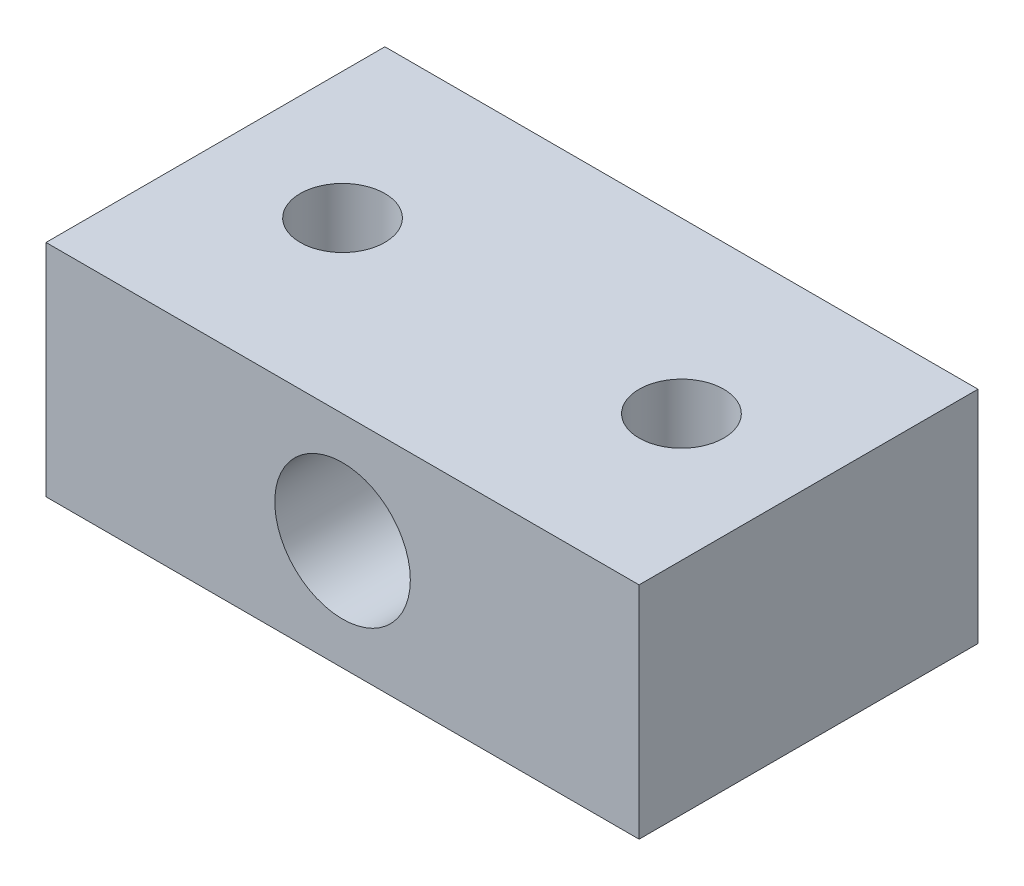
ISO-10303-21;
HEADER;
FILE_DESCRIPTION(('STEP AP214'),'2;1');
FILE_NAME('part.step','',(''),(''),'','','');
FILE_SCHEMA(('AUTOMOTIVE_DESIGN { 1 0 10303 214 1 1 1 1 }'));
ENDSEC;
DATA;
#1=APPLICATION_CONTEXT('core data for automotive mechanical design processes');
#2=APPLICATION_PROTOCOL_DEFINITION('international standard','automotive_design',2000,#1);
#3=PRODUCT_CONTEXT('',#1,'mechanical');
#4=PRODUCT('Part','Part','',(#3));
#5=PRODUCT_RELATED_PRODUCT_CATEGORY('part','',(#4));
#6=PRODUCT_DEFINITION_FORMATION('','',#4);
#7=PRODUCT_DEFINITION_CONTEXT('part definition',#1,'design');
#8=PRODUCT_DEFINITION('design','',#6,#7);
#9=PRODUCT_DEFINITION_SHAPE('','',#8);
#10=(LENGTH_UNIT() NAMED_UNIT(*) SI_UNIT(.MILLI.,.METRE.));
#11=(NAMED_UNIT(*) PLANE_ANGLE_UNIT() SI_UNIT($,.RADIAN.));
#12=(NAMED_UNIT(*) SI_UNIT($,.STERADIAN.) SOLID_ANGLE_UNIT());
#13=UNCERTAINTY_MEASURE_WITH_UNIT(LENGTH_MEASURE(1.E-05),#10,'distance_accuracy_value','');
#14=(GEOMETRIC_REPRESENTATION_CONTEXT(3) GLOBAL_UNCERTAINTY_ASSIGNED_CONTEXT((#13)) GLOBAL_UNIT_ASSIGNED_CONTEXT((#10,
#11,#12)) REPRESENTATION_CONTEXT('',''));
#15=CARTESIAN_POINT('',(0.,0.,0.));
#16=DIRECTION('',(0.,0.,1.));
#17=DIRECTION('',(1.,0.,0.));
#18=AXIS2_PLACEMENT_3D('',#15,#16,#17);
#19=CARTESIAN_POINT('',(0.,13.,0.));
#20=DIRECTION('',(0.,1.,0.));
#21=DIRECTION('',(0.,0.,1.));
#22=AXIS2_PLACEMENT_3D('',#19,#20,#21);
#23=PLANE('',#22);
#24=CARTESIAN_POINT('',(-10.,13.,0.));
#25=DIRECTION('',(0.,1.,0.));
#26=DIRECTION('',(0.,0.,1.));
#27=AXIS2_PLACEMENT_3D('',#24,#25,#26);
#28=CIRCLE('',#27,2.5);
#29=CARTESIAN_POINT('',(-10.,13.,2.5));
#30=VERTEX_POINT('',#29);
#31=EDGE_CURVE('E100',#30,#30,#28,.T.);
#32=ORIENTED_EDGE('',*,*,#31,.F.);
#33=EDGE_LOOP('',(#32));
#34=FACE_BOUND('',#33,.T.);
#35=DIRECTION('',(0.,0.,-1.));
#36=VECTOR('',#35,1.);
#37=CARTESIAN_POINT('',(17.5,13.,-10.));
#38=LINE('',#37,#36);
#39=CARTESIAN_POINT('',(17.5,13.,9.99999999999999));
#40=VERTEX_POINT('',#39);
#41=CARTESIAN_POINT('',(17.5,13.,-10.));
#42=VERTEX_POINT('',#41);
#43=EDGE_CURVE('E85',#40,#42,#38,.T.);
#44=ORIENTED_EDGE('',*,*,#43,.T.);
#45=DIRECTION('',(-1.,0.,0.));
#46=VECTOR('',#45,1.);
#47=CARTESIAN_POINT('',(-17.5,13.,-10.));
#48=LINE('',#47,#46);
#49=CARTESIAN_POINT('',(-17.5,13.,-10.));
#50=VERTEX_POINT('',#49);
#51=EDGE_CURVE('E80',#42,#50,#48,.T.);
#52=ORIENTED_EDGE('',*,*,#51,.T.);
#53=DIRECTION('',(0.,0.,1.));
#54=VECTOR('',#53,1.);
#55=CARTESIAN_POINT('',(-17.5,13.,-10.));
#56=LINE('',#55,#54);
#57=CARTESIAN_POINT('',(-17.5,13.,9.99999999999999));
#58=VERTEX_POINT('',#57);
#59=EDGE_CURVE('E83',#50,#58,#56,.T.);
#60=ORIENTED_EDGE('',*,*,#59,.T.);
#61=DIRECTION('',(1.,0.,0.));
#62=VECTOR('',#61,1.);
#63=CARTESIAN_POINT('',(-17.5,13.,9.99999999999999));
#64=LINE('',#63,#62);
#65=EDGE_CURVE('E50',#58,#40,#64,.T.);
#66=ORIENTED_EDGE('',*,*,#65,.T.);
#67=EDGE_LOOP('',(#44,#52,#60,#66));
#68=FACE_BOUND('',#67,.T.);
#69=CARTESIAN_POINT('',(9.99999999999996,13.,0.));
#70=DIRECTION('',(0.,1.,0.));
#71=DIRECTION('',(0.,0.,1.));
#72=AXIS2_PLACEMENT_3D('',#69,#70,#71);
#73=CIRCLE('',#72,2.5);
#74=CARTESIAN_POINT('',(9.99999999999996,13.,2.5));
#75=VERTEX_POINT('',#74);
#76=EDGE_CURVE('E115',#75,#75,#73,.T.);
#77=ORIENTED_EDGE('',*,*,#76,.F.);
#78=EDGE_LOOP('',(#77));
#79=FACE_BOUND('',#78,.T.);
#80=ADVANCED_FACE('F33',(#34,#68,#79),#23,.T.);
#81=CARTESIAN_POINT('',(0.,0.,0.));
#82=DIRECTION('',(0.,1.,0.));
#83=DIRECTION('',(0.,0.,1.));
#84=AXIS2_PLACEMENT_3D('',#81,#82,#83);
#85=PLANE('',#84);
#86=CARTESIAN_POINT('',(-10.,0.,0.));
#87=DIRECTION('',(0.,1.,0.));
#88=DIRECTION('',(0.,0.,1.));
#89=AXIS2_PLACEMENT_3D('',#86,#87,#88);
#90=CIRCLE('',#89,2.5);
#91=CARTESIAN_POINT('',(-10.,0.,2.5));
#92=VERTEX_POINT('',#91);
#93=EDGE_CURVE('E112',#92,#92,#90,.T.);
#94=ORIENTED_EDGE('',*,*,#93,.T.);
#95=EDGE_LOOP('',(#94));
#96=FACE_BOUND('',#95,.T.);
#97=DIRECTION('',(0.,0.,-1.));
#98=VECTOR('',#97,1.);
#99=CARTESIAN_POINT('',(17.5,0.,-10.));
#100=LINE('',#99,#98);
#101=CARTESIAN_POINT('',(17.5,0.,9.99999999999999));
#102=VERTEX_POINT('',#101);
#103=CARTESIAN_POINT('',(17.5,0.,-10.));
#104=VERTEX_POINT('',#103);
#105=EDGE_CURVE('E97',#102,#104,#100,.T.);
#106=ORIENTED_EDGE('',*,*,#105,.F.);
#107=DIRECTION('',(1.,0.,0.));
#108=VECTOR('',#107,1.);
#109=CARTESIAN_POINT('',(-17.5,0.,9.99999999999999));
#110=LINE('',#109,#108);
#111=CARTESIAN_POINT('',(-17.5,0.,9.99999999999999));
#112=VERTEX_POINT('',#111);
#113=EDGE_CURVE('E73',#112,#102,#110,.T.);
#114=ORIENTED_EDGE('',*,*,#113,.F.);
#115=DIRECTION('',(0.,0.,1.));
#116=VECTOR('',#115,1.);
#117=CARTESIAN_POINT('',(-17.5,0.,-10.));
#118=LINE('',#117,#116);
#119=CARTESIAN_POINT('',(-17.5,0.,-10.));
#120=VERTEX_POINT('',#119);
#121=EDGE_CURVE('E67',#120,#112,#118,.T.);
#122=ORIENTED_EDGE('',*,*,#121,.F.);
#123=DIRECTION('',(-1.,0.,0.));
#124=VECTOR('',#123,1.);
#125=CARTESIAN_POINT('',(-17.5,0.,-10.));
#126=LINE('',#125,#124);
#127=EDGE_CURVE('E89',#104,#120,#126,.T.);
#128=ORIENTED_EDGE('',*,*,#127,.F.);
#129=EDGE_LOOP('',(#106,#114,#122,#128));
#130=FACE_BOUND('',#129,.T.);
#131=CARTESIAN_POINT('',(9.99999999999996,0.,0.));
#132=DIRECTION('',(0.,1.,0.));
#133=DIRECTION('',(0.,0.,1.));
#134=AXIS2_PLACEMENT_3D('',#131,#132,#133);
#135=CIRCLE('',#134,2.5);
#136=CARTESIAN_POINT('',(9.99999999999996,0.,2.5));
#137=VERTEX_POINT('',#136);
#138=EDGE_CURVE('E118',#137,#137,#135,.T.);
#139=ORIENTED_EDGE('',*,*,#138,.T.);
#140=EDGE_LOOP('',(#139));
#141=FACE_BOUND('',#140,.T.);
#142=ADVANCED_FACE('F108',(#96,#130,#141),#85,.F.);
#143=CARTESIAN_POINT('',(17.5,13.,-10.));
#144=DIRECTION('',(-1.,0.,0.));
#145=DIRECTION('',(0.,0.,1.));
#146=AXIS2_PLACEMENT_3D('',#143,#144,#145);
#147=PLANE('',#146);
#148=ORIENTED_EDGE('',*,*,#105,.T.);
#149=DIRECTION('',(0.,-1.,0.));
#150=VECTOR('',#149,1.);
#151=CARTESIAN_POINT('',(17.5,13.,-10.));
#152=LINE('',#151,#150);
#153=EDGE_CURVE('E11',#42,#104,#152,.T.);
#154=ORIENTED_EDGE('',*,*,#153,.F.);
#155=ORIENTED_EDGE('',*,*,#43,.F.);
#156=DIRECTION('',(0.,-1.,0.));
#157=VECTOR('',#156,1.);
#158=CARTESIAN_POINT('',(17.5,13.,9.99999999999999));
#159=LINE('',#158,#157);
#160=EDGE_CURVE('E93',#40,#102,#159,.T.);
#161=ORIENTED_EDGE('',*,*,#160,.T.);
#162=EDGE_LOOP('',(#148,#154,#155,#161));
#163=FACE_BOUND('',#162,.T.);
#164=ADVANCED_FACE('F35',(#163),#147,.F.);
#165=CARTESIAN_POINT('',(-17.5,13.,-10.));
#166=DIRECTION('',(0.,0.,1.));
#167=DIRECTION('',(1.,0.,0.));
#168=AXIS2_PLACEMENT_3D('',#165,#166,#167);
#169=PLANE('',#168);
#170=CARTESIAN_POINT('',(0.,6.5,-10.));
#171=DIRECTION('',(0.,0.,1.));
#172=DIRECTION('',(1.,0.,0.));
#173=AXIS2_PLACEMENT_3D('',#170,#171,#172);
#174=CIRCLE('',#173,4.);
#175=CARTESIAN_POINT('',(4.,6.5,-10.));
#176=VERTEX_POINT('',#175);
#177=EDGE_CURVE('E121',#176,#176,#174,.T.);
#178=ORIENTED_EDGE('',*,*,#177,.T.);
#179=EDGE_LOOP('',(#178));
#180=FACE_BOUND('',#179,.T.);
#181=ORIENTED_EDGE('',*,*,#127,.T.);
#182=DIRECTION('',(0.,-1.,0.));
#183=VECTOR('',#182,1.);
#184=CARTESIAN_POINT('',(-17.5,13.,-10.));
#185=LINE('',#184,#183);
#186=EDGE_CURVE('E42',#50,#120,#185,.T.);
#187=ORIENTED_EDGE('',*,*,#186,.F.);
#188=ORIENTED_EDGE('',*,*,#51,.F.);
#189=ORIENTED_EDGE('',*,*,#153,.T.);
#190=EDGE_LOOP('',(#181,#187,#188,#189));
#191=FACE_BOUND('',#190,.T.);
#192=ADVANCED_FACE('F88',(#180,#191),#169,.F.);
#193=CARTESIAN_POINT('',(-17.5,13.,-10.));
#194=DIRECTION('',(1.,0.,0.));
#195=DIRECTION('',(0.,0.,-1.));
#196=AXIS2_PLACEMENT_3D('',#193,#194,#195);
#197=PLANE('',#196);
#198=ORIENTED_EDGE('',*,*,#121,.T.);
#199=DIRECTION('',(0.,-1.,0.));
#200=VECTOR('',#199,1.);
#201=CARTESIAN_POINT('',(-17.5,13.,9.99999999999999));
#202=LINE('',#201,#200);
#203=EDGE_CURVE('E90',#58,#112,#202,.T.);
#204=ORIENTED_EDGE('',*,*,#203,.F.);
#205=ORIENTED_EDGE('',*,*,#59,.F.);
#206=ORIENTED_EDGE('',*,*,#186,.T.);
#207=EDGE_LOOP('',(#198,#204,#205,#206));
#208=FACE_BOUND('',#207,.T.);
#209=ADVANCED_FACE('F91',(#208),#197,.F.);
#210=CARTESIAN_POINT('',(-17.5,13.,9.99999999999999));
#211=DIRECTION('',(0.,0.,-1.));
#212=DIRECTION('',(-1.,0.,0.));
#213=AXIS2_PLACEMENT_3D('',#210,#211,#212);
#214=PLANE('',#213);
#215=CARTESIAN_POINT('',(0.,6.5,9.99999999999999));
#216=DIRECTION('',(0.,0.,1.));
#217=DIRECTION('',(1.,0.,0.));
#218=AXIS2_PLACEMENT_3D('',#215,#216,#217);
#219=CIRCLE('',#218,4.);
#220=CARTESIAN_POINT('',(4.,6.5,9.99999999999999));
#221=VERTEX_POINT('',#220);
#222=EDGE_CURVE('E124',#221,#221,#219,.T.);
#223=ORIENTED_EDGE('',*,*,#222,.F.);
#224=EDGE_LOOP('',(#223));
#225=FACE_BOUND('',#224,.T.);
#226=ORIENTED_EDGE('',*,*,#113,.T.);
#227=ORIENTED_EDGE('',*,*,#160,.F.);
#228=ORIENTED_EDGE('',*,*,#65,.F.);
#229=ORIENTED_EDGE('',*,*,#203,.T.);
#230=EDGE_LOOP('',(#226,#227,#228,#229));
#231=FACE_BOUND('',#230,.T.);
#232=ADVANCED_FACE('F105',(#225,#231),#214,.F.);
#233=CARTESIAN_POINT('',(-10.,13.,0.));
#234=DIRECTION('',(0.,-1.,0.));
#235=DIRECTION('',(0.,0.,-1.));
#236=AXIS2_PLACEMENT_3D('',#233,#234,#235);
#237=CYLINDRICAL_SURFACE('',#236,2.5);
#238=ORIENTED_EDGE('',*,*,#31,.T.);
#239=EDGE_LOOP('',(#238));
#240=FACE_BOUND('',#239,.T.);
#241=ORIENTED_EDGE('',*,*,#93,.F.);
#242=EDGE_LOOP('',(#241));
#243=FACE_BOUND('',#242,.T.);
#244=ADVANCED_FACE('F139',(#240,#243),#237,.F.);
#245=CARTESIAN_POINT('',(9.99999999999996,13.,0.));
#246=DIRECTION('',(0.,-1.,0.));
#247=DIRECTION('',(0.,0.,-1.));
#248=AXIS2_PLACEMENT_3D('',#245,#246,#247);
#249=CYLINDRICAL_SURFACE('',#248,2.5);
#250=ORIENTED_EDGE('',*,*,#76,.T.);
#251=EDGE_LOOP('',(#250));
#252=FACE_BOUND('',#251,.T.);
#253=ORIENTED_EDGE('',*,*,#138,.F.);
#254=EDGE_LOOP('',(#253));
#255=FACE_BOUND('',#254,.T.);
#256=ADVANCED_FACE('F134',(#252,#255),#249,.F.);
#257=CARTESIAN_POINT('',(0.,6.5,-10.));
#258=DIRECTION('',(0.,0.,1.));
#259=DIRECTION('',(1.,0.,0.));
#260=AXIS2_PLACEMENT_3D('',#257,#258,#259);
#261=CYLINDRICAL_SURFACE('',#260,4.);
#262=ORIENTED_EDGE('',*,*,#177,.F.);
#263=EDGE_LOOP('',(#262));
#264=FACE_BOUND('',#263,.T.);
#265=ORIENTED_EDGE('',*,*,#222,.T.);
#266=EDGE_LOOP('',(#265));
#267=FACE_BOUND('',#266,.T.);
#268=ADVANCED_FACE('F131',(#264,#267),#261,.F.);
#269=CLOSED_SHELL('',(#80,#142,#164,#192,#209,#232,#244,#256,#268));
#270=MANIFOLD_SOLID_BREP('B2',#269);
#271=ADVANCED_BREP_SHAPE_REPRESENTATION('',(#18,#270),#14);
#272=SHAPE_DEFINITION_REPRESENTATION(#9,#271);
ENDSEC;
END-ISO-10303-21;
